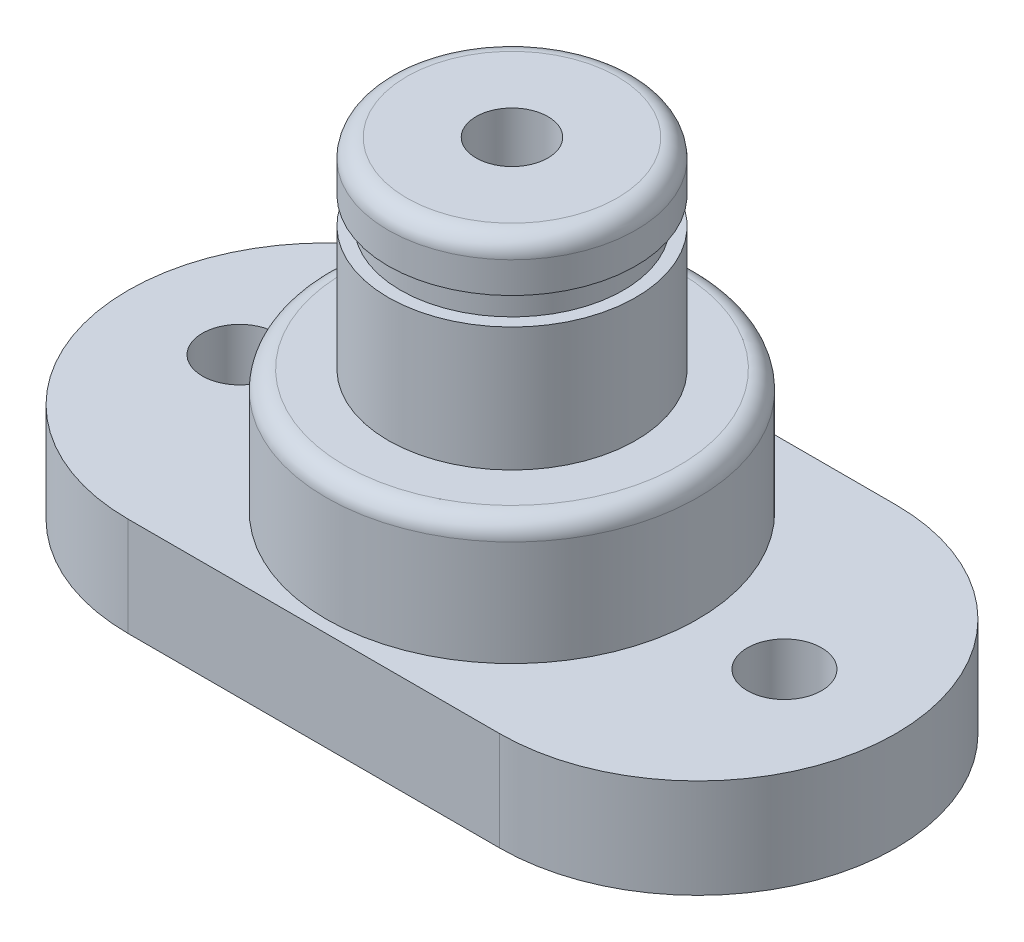
ISO-10303-21;
HEADER;
FILE_DESCRIPTION(('STEP AP214'),'2;1');
FILE_NAME('part.step','',(''),(''),'','','');
FILE_SCHEMA(('AUTOMOTIVE_DESIGN { 1 0 10303 214 1 1 1 1 }'));
ENDSEC;
DATA;
#1=APPLICATION_CONTEXT('core data for automotive mechanical design processes');
#2=APPLICATION_PROTOCOL_DEFINITION('international standard','automotive_design',2000,#1);
#3=PRODUCT_CONTEXT('',#1,'mechanical');
#4=PRODUCT('Part','Part','',(#3));
#5=PRODUCT_RELATED_PRODUCT_CATEGORY('part','',(#4));
#6=PRODUCT_DEFINITION_FORMATION('','',#4);
#7=PRODUCT_DEFINITION_CONTEXT('part definition',#1,'design');
#8=PRODUCT_DEFINITION('design','',#6,#7);
#9=PRODUCT_DEFINITION_SHAPE('','',#8);
#10=(LENGTH_UNIT() NAMED_UNIT(*) SI_UNIT(.MILLI.,.METRE.));
#11=(NAMED_UNIT(*) PLANE_ANGLE_UNIT() SI_UNIT($,.RADIAN.));
#12=(NAMED_UNIT(*) SI_UNIT($,.STERADIAN.) SOLID_ANGLE_UNIT());
#13=UNCERTAINTY_MEASURE_WITH_UNIT(LENGTH_MEASURE(1.E-05),#10,'distance_accuracy_value','');
#14=(GEOMETRIC_REPRESENTATION_CONTEXT(3) GLOBAL_UNCERTAINTY_ASSIGNED_CONTEXT((#13)) GLOBAL_UNIT_ASSIGNED_CONTEXT((#10,
#11,#12)) REPRESENTATION_CONTEXT('',''));
#15=CARTESIAN_POINT('',(0.,0.,0.));
#16=DIRECTION('',(0.,0.,1.));
#17=DIRECTION('',(1.,0.,0.));
#18=AXIS2_PLACEMENT_3D('',#15,#16,#17);
#19=CARTESIAN_POINT('',(-7.5,4.,0.));
#20=DIRECTION('',(0.,-1.,0.));
#21=DIRECTION('',(0.,0.,-1.));
#22=AXIS2_PLACEMENT_3D('',#19,#20,#21);
#23=CYLINDRICAL_SURFACE('',#22,8.);
#24=CARTESIAN_POINT('',(-7.5,0.,0.));
#25=DIRECTION('',(0.,1.,0.));
#26=DIRECTION('',(0.,0.,1.));
#27=AXIS2_PLACEMENT_3D('',#24,#25,#26);
#28=CIRCLE('',#27,8.);
#29=CARTESIAN_POINT('',(-7.5,0.,-8.));
#30=VERTEX_POINT('',#29);
#31=CARTESIAN_POINT('',(-7.49999999999999,0.,8.));
#32=VERTEX_POINT('',#31);
#33=EDGE_CURVE('E115',#30,#32,#28,.T.);
#34=ORIENTED_EDGE('',*,*,#33,.T.);
#35=DIRECTION('',(0.,-1.,0.));
#36=VECTOR('',#35,1.);
#37=CARTESIAN_POINT('',(-7.49999999999999,4.,8.));
#38=LINE('',#37,#36);
#39=CARTESIAN_POINT('',(-7.49999999999999,4.,8.));
#40=VERTEX_POINT('',#39);
#41=EDGE_CURVE('E94',#40,#32,#38,.T.);
#42=ORIENTED_EDGE('',*,*,#41,.F.);
#43=CARTESIAN_POINT('',(-7.5,4.,0.));
#44=DIRECTION('',(0.,1.,0.));
#45=DIRECTION('',(0.,0.,1.));
#46=AXIS2_PLACEMENT_3D('',#43,#44,#45);
#47=CIRCLE('',#46,8.);
#48=CARTESIAN_POINT('',(-7.5,4.,-8.));
#49=VERTEX_POINT('',#48);
#50=EDGE_CURVE('E82',#49,#40,#47,.T.);
#51=ORIENTED_EDGE('',*,*,#50,.F.);
#52=DIRECTION('',(0.,-1.,0.));
#53=VECTOR('',#52,1.);
#54=CARTESIAN_POINT('',(-7.5,4.,-8.));
#55=LINE('',#54,#53);
#56=EDGE_CURVE('E111',#49,#30,#55,.T.);
#57=ORIENTED_EDGE('',*,*,#56,.T.);
#58=EDGE_LOOP('',(#34,#42,#51,#57));
#59=FACE_BOUND('',#58,.T.);
#60=ADVANCED_FACE('F38',(#59),#23,.T.);
#61=CARTESIAN_POINT('',(0.,4.,8.));
#62=DIRECTION('',(0.,0.,1.));
#63=DIRECTION('',(1.,0.,0.));
#64=AXIS2_PLACEMENT_3D('',#61,#62,#63);
#65=PLANE('',#64);
#66=DIRECTION('',(-1.,0.,0.));
#67=VECTOR('',#66,1.);
#68=CARTESIAN_POINT('',(0.,0.,8.));
#69=LINE('',#68,#67);
#70=CARTESIAN_POINT('',(7.50000000000001,0.,7.99999999999999));
#71=VERTEX_POINT('',#70);
#72=EDGE_CURVE('E93',#71,#32,#69,.T.);
#73=ORIENTED_EDGE('',*,*,#72,.F.);
#74=DIRECTION('',(0.,-1.,0.));
#75=VECTOR('',#74,1.);
#76=CARTESIAN_POINT('',(7.50000000000001,4.,7.99999999999999));
#77=LINE('',#76,#75);
#78=CARTESIAN_POINT('',(7.50000000000001,4.,7.99999999999999));
#79=VERTEX_POINT('',#78);
#80=EDGE_CURVE('E88',#79,#71,#77,.T.);
#81=ORIENTED_EDGE('',*,*,#80,.F.);
#82=DIRECTION('',(-1.,0.,0.));
#83=VECTOR('',#82,1.);
#84=CARTESIAN_POINT('',(0.,4.,8.));
#85=LINE('',#84,#83);
#86=EDGE_CURVE('E91',#79,#40,#85,.T.);
#87=ORIENTED_EDGE('',*,*,#86,.T.);
#88=ORIENTED_EDGE('',*,*,#41,.T.);
#89=EDGE_LOOP('',(#73,#81,#87,#88));
#90=FACE_BOUND('',#89,.T.);
#91=ADVANCED_FACE('F90',(#90),#65,.T.);
#92=CARTESIAN_POINT('',(7.50000000000001,4.,0.));
#93=DIRECTION('',(0.,-1.,0.));
#94=DIRECTION('',(0.,0.,-1.));
#95=AXIS2_PLACEMENT_3D('',#92,#93,#94);
#96=CYLINDRICAL_SURFACE('',#95,7.99999999999999);
#97=CARTESIAN_POINT('',(7.50000000000001,0.,0.));
#98=DIRECTION('',(0.,1.,0.));
#99=DIRECTION('',(0.,0.,1.));
#100=AXIS2_PLACEMENT_3D('',#97,#98,#99);
#101=CIRCLE('',#100,7.99999999999999);
#102=CARTESIAN_POINT('',(7.50000000000001,0.,-7.99999999999999));
#103=VERTEX_POINT('',#102);
#104=EDGE_CURVE('E71',#71,#103,#101,.T.);
#105=ORIENTED_EDGE('',*,*,#104,.T.);
#106=DIRECTION('',(0.,-1.,0.));
#107=VECTOR('',#106,1.);
#108=CARTESIAN_POINT('',(7.50000000000001,4.,-7.99999999999999));
#109=LINE('',#108,#107);
#110=CARTESIAN_POINT('',(7.50000000000001,4.,-7.99999999999999));
#111=VERTEX_POINT('',#110);
#112=EDGE_CURVE('E95',#111,#103,#109,.T.);
#113=ORIENTED_EDGE('',*,*,#112,.F.);
#114=CARTESIAN_POINT('',(7.50000000000001,4.,0.));
#115=DIRECTION('',(0.,1.,0.));
#116=DIRECTION('',(0.,0.,1.));
#117=AXIS2_PLACEMENT_3D('',#114,#115,#116);
#118=CIRCLE('',#117,7.99999999999999);
#119=EDGE_CURVE('E97',#79,#111,#118,.T.);
#120=ORIENTED_EDGE('',*,*,#119,.F.);
#121=ORIENTED_EDGE('',*,*,#80,.T.);
#122=EDGE_LOOP('',(#105,#113,#120,#121));
#123=FACE_BOUND('',#122,.T.);
#124=ADVANCED_FACE('F98',(#123),#96,.T.);
#125=CARTESIAN_POINT('',(0.,4.,-8.));
#126=DIRECTION('',(0.,0.,1.));
#127=DIRECTION('',(1.,0.,0.));
#128=AXIS2_PLACEMENT_3D('',#125,#126,#127);
#129=PLANE('',#128);
#130=DIRECTION('',(-1.,0.,0.));
#131=VECTOR('',#130,1.);
#132=CARTESIAN_POINT('',(0.,0.,-8.));
#133=LINE('',#132,#131);
#134=EDGE_CURVE('E77',#103,#30,#133,.T.);
#135=ORIENTED_EDGE('',*,*,#134,.T.);
#136=ORIENTED_EDGE('',*,*,#56,.F.);
#137=DIRECTION('',(-1.,0.,0.));
#138=VECTOR('',#137,1.);
#139=CARTESIAN_POINT('',(0.,4.,-8.));
#140=LINE('',#139,#138);
#141=EDGE_CURVE('E55',#111,#49,#140,.T.);
#142=ORIENTED_EDGE('',*,*,#141,.F.);
#143=ORIENTED_EDGE('',*,*,#112,.T.);
#144=EDGE_LOOP('',(#135,#136,#142,#143));
#145=FACE_BOUND('',#144,.T.);
#146=ADVANCED_FACE('F158',(#145),#129,.F.);
#147=CARTESIAN_POINT('',(-11.,4.,0.));
#148=DIRECTION('',(0.,-1.,0.));
#149=DIRECTION('',(0.,0.,-1.));
#150=AXIS2_PLACEMENT_3D('',#147,#148,#149);
#151=CYLINDRICAL_SURFACE('',#150,1.5);
#152=CARTESIAN_POINT('',(-11.,4.,0.));
#153=DIRECTION('',(0.,1.,0.));
#154=DIRECTION('',(0.,0.,1.));
#155=AXIS2_PLACEMENT_3D('',#152,#153,#154);
#156=CIRCLE('',#155,1.5);
#157=CARTESIAN_POINT('',(-11.,4.,1.5));
#158=VERTEX_POINT('',#157);
#159=EDGE_CURVE('E103',#158,#158,#156,.T.);
#160=ORIENTED_EDGE('',*,*,#159,.T.);
#161=EDGE_LOOP('',(#160));
#162=FACE_BOUND('',#161,.T.);
#163=CARTESIAN_POINT('',(-11.,0.,0.));
#164=DIRECTION('',(0.,1.,0.));
#165=DIRECTION('',(0.,0.,1.));
#166=AXIS2_PLACEMENT_3D('',#163,#164,#165);
#167=CIRCLE('',#166,1.5);
#168=CARTESIAN_POINT('',(-11.,0.,1.5));
#169=VERTEX_POINT('',#168);
#170=EDGE_CURVE('E112',#169,#169,#167,.T.);
#171=ORIENTED_EDGE('',*,*,#170,.F.);
#172=EDGE_LOOP('',(#171));
#173=FACE_BOUND('',#172,.T.);
#174=ADVANCED_FACE('F155',(#162,#173),#151,.F.);
#175=CARTESIAN_POINT('',(11.,4.,0.));
#176=DIRECTION('',(0.,-1.,0.));
#177=DIRECTION('',(0.,0.,-1.));
#178=AXIS2_PLACEMENT_3D('',#175,#176,#177);
#179=CYLINDRICAL_SURFACE('',#178,1.5);
#180=CARTESIAN_POINT('',(11.,4.,0.));
#181=DIRECTION('',(0.,1.,0.));
#182=DIRECTION('',(0.,0.,1.));
#183=AXIS2_PLACEMENT_3D('',#180,#181,#182);
#184=CIRCLE('',#183,1.5);
#185=CARTESIAN_POINT('',(11.,4.,1.5));
#186=VERTEX_POINT('',#185);
#187=EDGE_CURVE('E108',#186,#186,#184,.T.);
#188=ORIENTED_EDGE('',*,*,#187,.T.);
#189=EDGE_LOOP('',(#188));
#190=FACE_BOUND('',#189,.T.);
#191=CARTESIAN_POINT('',(11.,0.,0.));
#192=DIRECTION('',(0.,1.,0.));
#193=DIRECTION('',(0.,0.,1.));
#194=AXIS2_PLACEMENT_3D('',#191,#192,#193);
#195=CIRCLE('',#194,1.5);
#196=CARTESIAN_POINT('',(11.,0.,1.5));
#197=VERTEX_POINT('',#196);
#198=EDGE_CURVE('E122',#197,#197,#195,.T.);
#199=ORIENTED_EDGE('',*,*,#198,.F.);
#200=EDGE_LOOP('',(#199));
#201=FACE_BOUND('',#200,.T.);
#202=ADVANCED_FACE('F157',(#190,#201),#179,.F.);
#203=CARTESIAN_POINT('',(0.,4.,0.));
#204=DIRECTION('',(0.,1.,0.));
#205=DIRECTION('',(0.,0.,1.));
#206=AXIS2_PLACEMENT_3D('',#203,#204,#205);
#207=PLANE('',#206);
#208=CARTESIAN_POINT('',(0.,4.,0.));
#209=DIRECTION('',(0.,1.,0.));
#210=DIRECTION('',(0.,0.,1.));
#211=AXIS2_PLACEMENT_3D('',#208,#209,#210);
#212=CIRCLE('',#211,7.5);
#213=CARTESIAN_POINT('',(0.,4.,7.5));
#214=VERTEX_POINT('',#213);
#215=EDGE_CURVE('E116',#214,#214,#212,.T.);
#216=ORIENTED_EDGE('',*,*,#215,.F.);
#217=EDGE_LOOP('',(#216));
#218=FACE_BOUND('',#217,.T.);
#219=ORIENTED_EDGE('',*,*,#159,.F.);
#220=EDGE_LOOP('',(#219));
#221=FACE_BOUND('',#220,.T.);
#222=ORIENTED_EDGE('',*,*,#50,.T.);
#223=ORIENTED_EDGE('',*,*,#86,.F.);
#224=ORIENTED_EDGE('',*,*,#119,.T.);
#225=ORIENTED_EDGE('',*,*,#141,.T.);
#226=EDGE_LOOP('',(#222,#223,#224,#225));
#227=FACE_BOUND('',#226,.T.);
#228=ORIENTED_EDGE('',*,*,#187,.F.);
#229=EDGE_LOOP('',(#228));
#230=FACE_BOUND('',#229,.T.);
#231=ADVANCED_FACE('F100',(#218,#221,#227,#230),#207,.T.);
#232=CARTESIAN_POINT('',(0.,0.,0.));
#233=DIRECTION('',(0.,1.,0.));
#234=DIRECTION('',(0.,0.,1.));
#235=AXIS2_PLACEMENT_3D('',#232,#233,#234);
#236=PLANE('',#235);
#237=CARTESIAN_POINT('',(0.,0.,0.));
#238=DIRECTION('',(0.,-1.,0.));
#239=DIRECTION('',(0.,0.,-1.));
#240=AXIS2_PLACEMENT_3D('',#237,#238,#239);
#241=CIRCLE('',#240,1.45);
#242=CARTESIAN_POINT('',(0.,0.,-1.45));
#243=VERTEX_POINT('',#242);
#244=EDGE_CURVE('E331',#243,#243,#241,.T.);
#245=ORIENTED_EDGE('',*,*,#244,.F.);
#246=EDGE_LOOP('',(#245));
#247=FACE_BOUND('',#246,.T.);
#248=ORIENTED_EDGE('',*,*,#170,.T.);
#249=EDGE_LOOP('',(#248));
#250=FACE_BOUND('',#249,.T.);
#251=ORIENTED_EDGE('',*,*,#33,.F.);
#252=ORIENTED_EDGE('',*,*,#134,.F.);
#253=ORIENTED_EDGE('',*,*,#104,.F.);
#254=ORIENTED_EDGE('',*,*,#72,.T.);
#255=EDGE_LOOP('',(#251,#252,#253,#254));
#256=FACE_BOUND('',#255,.T.);
#257=ORIENTED_EDGE('',*,*,#198,.T.);
#258=EDGE_LOOP('',(#257));
#259=FACE_BOUND('',#258,.T.);
#260=ADVANCED_FACE('F172',(#247,#250,#256,#259),#236,.F.);
#261=CARTESIAN_POINT('',(0.,9.,0.));
#262=DIRECTION('',(0.,-1.,0.));
#263=DIRECTION('',(0.,0.,-1.));
#264=AXIS2_PLACEMENT_3D('',#261,#262,#263);
#265=CYLINDRICAL_SURFACE('',#264,7.5);
#266=CARTESIAN_POINT('',(0.,8.25,0.));
#267=DIRECTION('',(0.,1.,0.));
#268=DIRECTION('',(0.,0.,1.));
#269=AXIS2_PLACEMENT_3D('',#266,#267,#268);
#270=CIRCLE('',#269,7.5);
#271=CARTESIAN_POINT('',(0.,8.25,7.5));
#272=VERTEX_POINT('',#271);
#273=EDGE_CURVE('E131',#272,#272,#270,.F.);
#274=ORIENTED_EDGE('',*,*,#273,.T.);
#275=EDGE_LOOP('',(#274));
#276=FACE_BOUND('',#275,.T.);
#277=ORIENTED_EDGE('',*,*,#215,.T.);
#278=EDGE_LOOP('',(#277));
#279=FACE_BOUND('',#278,.T.);
#280=ADVANCED_FACE('F175',(#276,#279),#265,.T.);
#281=CARTESIAN_POINT('',(0.,9.,0.));
#282=DIRECTION('',(0.,1.,0.));
#283=DIRECTION('',(0.,0.,1.));
#284=AXIS2_PLACEMENT_3D('',#281,#282,#283);
#285=PLANE('',#284);
#286=CARTESIAN_POINT('',(0.,9.,0.));
#287=DIRECTION('',(0.,1.,0.));
#288=DIRECTION('',(0.,0.,1.));
#289=AXIS2_PLACEMENT_3D('',#286,#287,#288);
#290=CIRCLE('',#289,6.75);
#291=CARTESIAN_POINT('',(0.,9.,6.75));
#292=VERTEX_POINT('',#291);
#293=EDGE_CURVE('E128',#292,#292,#290,.T.);
#294=ORIENTED_EDGE('',*,*,#293,.T.);
#295=EDGE_LOOP('',(#294));
#296=FACE_BOUND('',#295,.T.);
#297=CARTESIAN_POINT('',(0.,9.,0.));
#298=DIRECTION('',(0.,1.,0.));
#299=DIRECTION('',(0.,0.,1.));
#300=AXIS2_PLACEMENT_3D('',#297,#298,#299);
#301=CIRCLE('',#300,5.);
#302=CARTESIAN_POINT('',(0.,9.,5.));
#303=VERTEX_POINT('',#302);
#304=EDGE_CURVE('E340',#303,#303,#301,.T.);
#305=ORIENTED_EDGE('',*,*,#304,.F.);
#306=EDGE_LOOP('',(#305));
#307=FACE_BOUND('',#306,.T.);
#308=ADVANCED_FACE('F186',(#296,#307),#285,.T.);
#309=CARTESIAN_POINT('',(0.,14.,0.));
#310=DIRECTION('',(0.,-1.,0.));
#311=DIRECTION('',(0.,0.,-1.));
#312=AXIS2_PLACEMENT_3D('',#309,#310,#311);
#313=CYLINDRICAL_SURFACE('',#312,5.);
#314=CARTESIAN_POINT('',(0.,14.,0.));
#315=DIRECTION('',(0.,1.,0.));
#316=DIRECTION('',(0.,0.,1.));
#317=AXIS2_PLACEMENT_3D('',#314,#315,#316);
#318=CIRCLE('',#317,5.);
#319=CARTESIAN_POINT('',(0.,14.,5.));
#320=VERTEX_POINT('',#319);
#321=EDGE_CURVE('E343',#320,#320,#318,.T.);
#322=ORIENTED_EDGE('',*,*,#321,.F.);
#323=EDGE_LOOP('',(#322));
#324=FACE_BOUND('',#323,.T.);
#325=ORIENTED_EDGE('',*,*,#304,.T.);
#326=EDGE_LOOP('',(#325));
#327=FACE_BOUND('',#326,.T.);
#328=ADVANCED_FACE('F225',(#324,#327),#313,.T.);
#329=CARTESIAN_POINT('',(0.,14.,0.));
#330=DIRECTION('',(0.,1.,0.));
#331=DIRECTION('',(0.,0.,1.));
#332=AXIS2_PLACEMENT_3D('',#329,#330,#331);
#333=PLANE('',#332);
#334=CARTESIAN_POINT('',(0.,14.,0.));
#335=DIRECTION('',(0.,1.,0.));
#336=DIRECTION('',(0.,0.,1.));
#337=AXIS2_PLACEMENT_3D('',#334,#335,#336);
#338=CIRCLE('',#337,4.5);
#339=CARTESIAN_POINT('',(0.,14.,4.5));
#340=VERTEX_POINT('',#339);
#341=EDGE_CURVE('E336',#340,#340,#338,.T.);
#342=ORIENTED_EDGE('',*,*,#341,.F.);
#343=EDGE_LOOP('',(#342));
#344=FACE_BOUND('',#343,.T.);
#345=ORIENTED_EDGE('',*,*,#321,.T.);
#346=EDGE_LOOP('',(#345));
#347=FACE_BOUND('',#346,.T.);
#348=ADVANCED_FACE('F230',(#344,#347),#333,.T.);
#349=CARTESIAN_POINT('',(0.,15.1,0.));
#350=DIRECTION('',(0.,-1.,0.));
#351=DIRECTION('',(0.,0.,-1.));
#352=AXIS2_PLACEMENT_3D('',#349,#350,#351);
#353=CYLINDRICAL_SURFACE('',#352,4.5);
#354=CARTESIAN_POINT('',(0.,15.1,0.));
#355=DIRECTION('',(0.,1.,0.));
#356=DIRECTION('',(0.,0.,1.));
#357=AXIS2_PLACEMENT_3D('',#354,#355,#356);
#358=CIRCLE('',#357,4.5);
#359=CARTESIAN_POINT('',(0.,15.1,4.5));
#360=VERTEX_POINT('',#359);
#361=EDGE_CURVE('E337',#360,#360,#358,.T.);
#362=ORIENTED_EDGE('',*,*,#361,.F.);
#363=EDGE_LOOP('',(#362));
#364=FACE_BOUND('',#363,.T.);
#365=ORIENTED_EDGE('',*,*,#341,.T.);
#366=EDGE_LOOP('',(#365));
#367=FACE_BOUND('',#366,.T.);
#368=ADVANCED_FACE('F242',(#364,#367),#353,.T.);
#369=CARTESIAN_POINT('',(0.,15.1,0.));
#370=DIRECTION('',(0.,-1.,0.));
#371=DIRECTION('',(0.,0.,-1.));
#372=AXIS2_PLACEMENT_3D('',#369,#370,#371);
#373=CYLINDRICAL_SURFACE('',#372,1.45);
#374=ORIENTED_EDGE('',*,*,#244,.T.);
#375=EDGE_LOOP('',(#374));
#376=FACE_BOUND('',#375,.T.);
#377=CARTESIAN_POINT('',(0.,17.1,0.));
#378=DIRECTION('',(0.,-1.,0.));
#379=DIRECTION('',(0.,0.,-1.));
#380=AXIS2_PLACEMENT_3D('',#377,#378,#379);
#381=CIRCLE('',#380,1.45);
#382=CARTESIAN_POINT('',(0.,17.1,-1.45));
#383=VERTEX_POINT('',#382);
#384=EDGE_CURVE('E326',#383,#383,#381,.T.);
#385=ORIENTED_EDGE('',*,*,#384,.F.);
#386=EDGE_LOOP('',(#385));
#387=FACE_BOUND('',#386,.T.);
#388=ADVANCED_FACE('F251',(#376,#387),#373,.F.);
#389=CARTESIAN_POINT('',(0.,15.1,0.));
#390=DIRECTION('',(0.,1.,0.));
#391=DIRECTION('',(0.,0.,1.));
#392=AXIS2_PLACEMENT_3D('',#389,#390,#391);
#393=PLANE('',#392);
#394=CARTESIAN_POINT('',(0.,15.1,0.));
#395=DIRECTION('',(0.,1.,0.));
#396=DIRECTION('',(0.,0.,1.));
#397=AXIS2_PLACEMENT_3D('',#394,#395,#396);
#398=CIRCLE('',#397,5.);
#399=CARTESIAN_POINT('',(0.,15.1,5.));
#400=VERTEX_POINT('',#399);
#401=EDGE_CURVE('E328',#400,#400,#398,.T.);
#402=ORIENTED_EDGE('',*,*,#401,.F.);
#403=EDGE_LOOP('',(#402));
#404=FACE_BOUND('',#403,.T.);
#405=ORIENTED_EDGE('',*,*,#361,.T.);
#406=EDGE_LOOP('',(#405));
#407=FACE_BOUND('',#406,.T.);
#408=ADVANCED_FACE('F266',(#404,#407),#393,.F.);
#409=CARTESIAN_POINT('',(0.,17.1,0.));
#410=DIRECTION('',(0.,-1.,0.));
#411=DIRECTION('',(0.,0.,-1.));
#412=AXIS2_PLACEMENT_3D('',#409,#410,#411);
#413=CYLINDRICAL_SURFACE('',#412,5.);
#414=CARTESIAN_POINT('',(0.,16.35,0.));
#415=DIRECTION('',(0.,1.,0.));
#416=DIRECTION('',(0.,0.,1.));
#417=AXIS2_PLACEMENT_3D('',#414,#415,#416);
#418=CIRCLE('',#417,5.);
#419=CARTESIAN_POINT('',(0.,16.35,5.));
#420=VERTEX_POINT('',#419);
#421=EDGE_CURVE('E11',#420,#420,#418,.F.);
#422=ORIENTED_EDGE('',*,*,#421,.T.);
#423=EDGE_LOOP('',(#422));
#424=FACE_BOUND('',#423,.T.);
#425=ORIENTED_EDGE('',*,*,#401,.T.);
#426=EDGE_LOOP('',(#425));
#427=FACE_BOUND('',#426,.T.);
#428=ADVANCED_FACE('F271',(#424,#427),#413,.T.);
#429=CARTESIAN_POINT('',(0.,17.1,0.));
#430=DIRECTION('',(0.,1.,0.));
#431=DIRECTION('',(0.,0.,1.));
#432=AXIS2_PLACEMENT_3D('',#429,#430,#431);
#433=PLANE('',#432);
#434=ORIENTED_EDGE('',*,*,#384,.T.);
#435=EDGE_LOOP('',(#434));
#436=FACE_BOUND('',#435,.T.);
#437=CARTESIAN_POINT('',(0.,17.1,0.));
#438=DIRECTION('',(0.,1.,0.));
#439=DIRECTION('',(0.,0.,1.));
#440=AXIS2_PLACEMENT_3D('',#437,#438,#439);
#441=CIRCLE('',#440,4.25);
#442=CARTESIAN_POINT('',(0.,17.1,4.25));
#443=VERTEX_POINT('',#442);
#444=EDGE_CURVE('E47',#443,#443,#441,.T.);
#445=ORIENTED_EDGE('',*,*,#444,.T.);
#446=EDGE_LOOP('',(#445));
#447=FACE_BOUND('',#446,.T.);
#448=ADVANCED_FACE('F136',(#436,#447),#433,.T.);
#449=CARTESIAN_POINT('',(0.,8.25,0.));
#450=DIRECTION('',(0.,1.,0.));
#451=DIRECTION('',(0.,0.,1.));
#452=AXIS2_PLACEMENT_3D('',#449,#450,#451);
#453=TOROIDAL_SURFACE('',#452,6.75,0.75);
#454=ORIENTED_EDGE('',*,*,#273,.F.);
#455=EDGE_LOOP('',(#454));
#456=FACE_BOUND('',#455,.T.);
#457=ORIENTED_EDGE('',*,*,#293,.F.);
#458=EDGE_LOOP('',(#457));
#459=FACE_BOUND('',#458,.T.);
#460=ADVANCED_FACE('F139',(#456,#459),#453,.T.);
#461=CARTESIAN_POINT('',(0.,16.35,0.));
#462=DIRECTION('',(0.,1.,0.));
#463=DIRECTION('',(0.,0.,1.));
#464=AXIS2_PLACEMENT_3D('',#461,#462,#463);
#465=TOROIDAL_SURFACE('',#464,4.25,0.75);
#466=ORIENTED_EDGE('',*,*,#421,.F.);
#467=EDGE_LOOP('',(#466));
#468=FACE_BOUND('',#467,.T.);
#469=ORIENTED_EDGE('',*,*,#444,.F.);
#470=EDGE_LOOP('',(#469));
#471=FACE_BOUND('',#470,.T.);
#472=ADVANCED_FACE('F40',(#468,#471),#465,.T.);
#473=CLOSED_SHELL('',(#60,#91,#124,#146,#174,#202,#231,#260,#280,#308,#328,#348,#368,#388,#408,
#428,#448,#460,#472));
#474=MANIFOLD_SOLID_BREP('B2',#473);
#475=ADVANCED_BREP_SHAPE_REPRESENTATION('',(#18,#474),#14);
#476=SHAPE_DEFINITION_REPRESENTATION(#9,#475);
ENDSEC;
END-ISO-10303-21;
